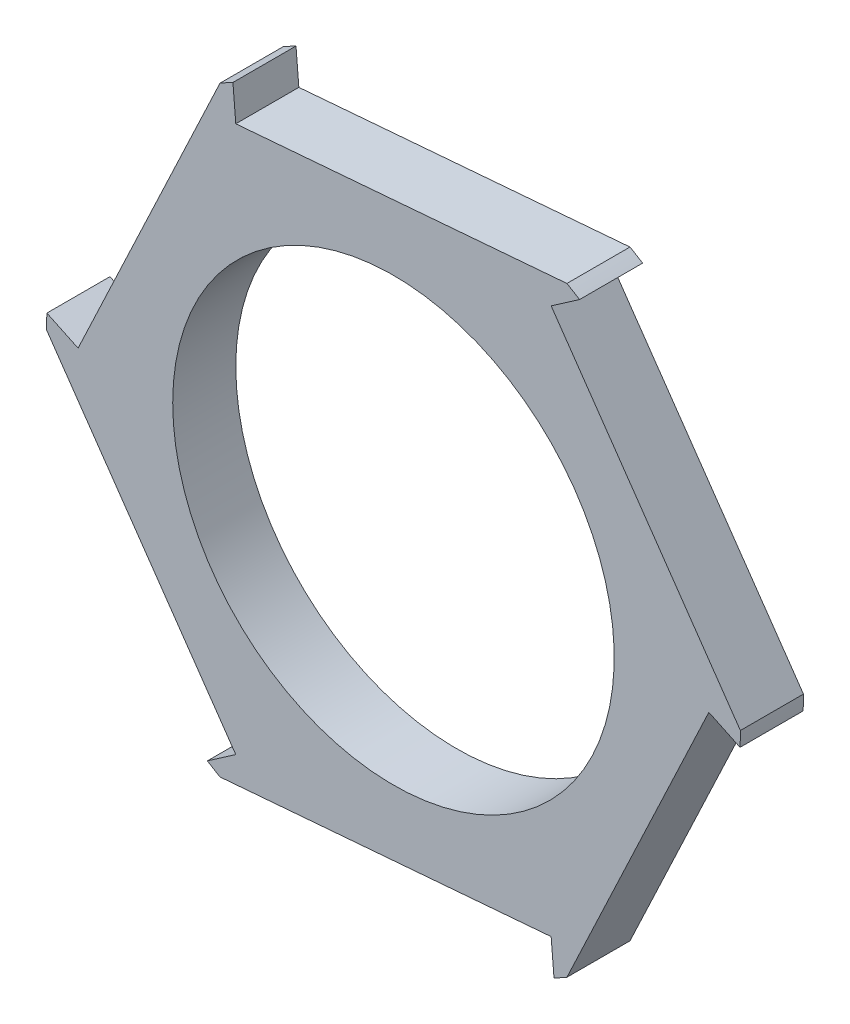
ISO-10303-21;
HEADER;
FILE_DESCRIPTION(('STEP AP214'),'2;1');
FILE_NAME('part.step','',(''),(''),'','','');
FILE_SCHEMA(('AUTOMOTIVE_DESIGN { 1 0 10303 214 1 1 1 1 }'));
ENDSEC;
DATA;
#1=APPLICATION_CONTEXT('core data for automotive mechanical design processes');
#2=APPLICATION_PROTOCOL_DEFINITION('international standard','automotive_design',2000,#1);
#3=PRODUCT_CONTEXT('',#1,'mechanical');
#4=PRODUCT('Part','Part','',(#3));
#5=PRODUCT_RELATED_PRODUCT_CATEGORY('part','',(#4));
#6=PRODUCT_DEFINITION_FORMATION('','',#4);
#7=PRODUCT_DEFINITION_CONTEXT('part definition',#1,'design');
#8=PRODUCT_DEFINITION('design','',#6,#7);
#9=PRODUCT_DEFINITION_SHAPE('','',#8);
#10=(LENGTH_UNIT() NAMED_UNIT(*) SI_UNIT(.MILLI.,.METRE.));
#11=(NAMED_UNIT(*) PLANE_ANGLE_UNIT() SI_UNIT($,.RADIAN.));
#12=(NAMED_UNIT(*) SI_UNIT($,.STERADIAN.) SOLID_ANGLE_UNIT());
#13=UNCERTAINTY_MEASURE_WITH_UNIT(LENGTH_MEASURE(1.E-05),#10,'distance_accuracy_value','');
#14=(GEOMETRIC_REPRESENTATION_CONTEXT(3) GLOBAL_UNCERTAINTY_ASSIGNED_CONTEXT((#13)) GLOBAL_UNIT_ASSIGNED_CONTEXT((#10,
#11,#12)) REPRESENTATION_CONTEXT('',''));
#15=CARTESIAN_POINT('',(0.,0.,0.));
#16=DIRECTION('',(0.,0.,1.));
#17=DIRECTION('',(1.,0.,0.));
#18=AXIS2_PLACEMENT_3D('',#15,#16,#17);
#19=CARTESIAN_POINT('',(-74.3243243243249,-51.493402387183,20.));
#20=DIRECTION('',(-0.821994936526787,-0.569494797451498,0.));
#21=DIRECTION('',(0.569494797451498,-0.821994936526787,0.));
#22=AXIS2_PLACEMENT_3D('',#19,#20,#21);
#23=PLANE('',#22);
#24=DIRECTION('',(-0.569494797451498,0.821994936526787,0.));
#25=VECTOR('',#24,1.);
#26=CARTESIAN_POINT('',(-74.3243243243249,-51.493402387183,0.));
#27=LINE('',#26,#25);
#28=CARTESIAN_POINT('',(-49.9999999999992,-86.6025403784443,0.));
#29=VERTEX_POINT('',#28);
#30=CARTESIAN_POINT('',(-110.000000000001,-4.59486077078278E-13,0.));
#31=VERTEX_POINT('',#30);
#32=EDGE_CURVE('E200',#29,#31,#27,.T.);
#33=ORIENTED_EDGE('',*,*,#32,.F.);
#34=DIRECTION('',(0.,0.,-1.));
#35=VECTOR('',#34,1.);
#36=CARTESIAN_POINT('',(-49.9999999999992,-86.6025403784443,20.));
#37=LINE('',#36,#35);
#38=CARTESIAN_POINT('',(-49.9999999999992,-86.6025403784443,20.));
#39=VERTEX_POINT('',#38);
#40=EDGE_CURVE('E11',#39,#29,#37,.T.);
#41=ORIENTED_EDGE('',*,*,#40,.F.);
#42=DIRECTION('',(-0.569494797451498,0.821994936526787,0.));
#43=VECTOR('',#42,1.);
#44=CARTESIAN_POINT('',(-74.3243243243249,-51.493402387183,20.));
#45=LINE('',#44,#43);
#46=CARTESIAN_POINT('',(-110.000000000001,-4.59486077078278E-13,20.));
#47=VERTEX_POINT('',#46);
#48=EDGE_CURVE('E263',#39,#47,#45,.T.);
#49=ORIENTED_EDGE('',*,*,#48,.T.);
#50=DIRECTION('',(0.,0.,-1.));
#51=VECTOR('',#50,1.);
#52=CARTESIAN_POINT('',(-110.000000000001,-4.59486077078278E-13,20.));
#53=LINE('',#52,#51);
#54=EDGE_CURVE('E121',#47,#31,#53,.T.);
#55=ORIENTED_EDGE('',*,*,#54,.T.);
#56=EDGE_LOOP('',(#33,#41,#49,#55));
#57=FACE_BOUND('',#56,.T.);
#58=ADVANCED_FACE('F40',(#57),#23,.T.);
#59=CARTESIAN_POINT('',(24.3243243243242,-35.1091379912608,20.));
#60=DIRECTION('',(0.5694947974515,-0.821994936526786,0.));
#61=DIRECTION('',(0.821994936526786,0.5694947974515,0.));
#62=AXIS2_PLACEMENT_3D('',#59,#60,#61);
#63=PLANE('',#62);
#64=DIRECTION('',(-0.821994936526786,-0.5694947974515,0.));
#65=VECTOR('',#64,1.);
#66=CARTESIAN_POINT('',(24.3243243243242,-35.1091379912608,0.));
#67=LINE('',#66,#65);
#68=CARTESIAN_POINT('',(-59.0004865376652,-92.838260368874,0.));
#69=VERTEX_POINT('',#68);
#70=EDGE_CURVE('E204',#29,#69,#67,.T.);
#71=ORIENTED_EDGE('',*,*,#70,.T.);
#72=DIRECTION('',(0.,0.,-1.));
#73=VECTOR('',#72,1.);
#74=CARTESIAN_POINT('',(-59.0004865376652,-92.838260368874,20.));
#75=LINE('',#74,#73);
#76=CARTESIAN_POINT('',(-59.0004865376652,-92.838260368874,20.));
#77=VERTEX_POINT('',#76);
#78=EDGE_CURVE('E49',#77,#69,#75,.T.);
#79=ORIENTED_EDGE('',*,*,#78,.F.);
#80=DIRECTION('',(-0.821994936526786,-0.5694947974515,0.));
#81=VECTOR('',#80,1.);
#82=CARTESIAN_POINT('',(24.3243243243242,-35.1091379912608,20.));
#83=LINE('',#82,#81);
#84=EDGE_CURVE('E338',#39,#77,#83,.T.);
#85=ORIENTED_EDGE('',*,*,#84,.F.);
#86=ORIENTED_EDGE('',*,*,#40,.T.);
#87=EDGE_LOOP('',(#71,#79,#85,#86));
#88=FACE_BOUND('',#87,.T.);
#89=ADVANCED_FACE('F408',(#88),#63,.F.);
#90=CARTESIAN_POINT('',(0.,0.,20.));
#91=DIRECTION('',(0.,0.,-1.));
#92=DIRECTION('',(-1.,0.,0.));
#93=AXIS2_PLACEMENT_3D('',#90,#91,#92);
#94=CYLINDRICAL_SURFACE('',#93,110.);
#95=CARTESIAN_POINT('',(0.,0.,0.));
#96=DIRECTION('',(0.,0.,1.));
#97=DIRECTION('',(1.,0.,0.));
#98=AXIS2_PLACEMENT_3D('',#95,#96,#97);
#99=CIRCLE('',#98,110.);
#100=CARTESIAN_POINT('',(-55.0000000000003,-95.2627944162884,0.));
#101=VERTEX_POINT('',#100);
#102=EDGE_CURVE('E208',#69,#101,#99,.T.);
#103=ORIENTED_EDGE('',*,*,#102,.T.);
#104=DIRECTION('',(0.,0.,-1.));
#105=VECTOR('',#104,1.);
#106=CARTESIAN_POINT('',(-55.0000000000003,-95.2627944162884,20.));
#107=LINE('',#106,#105);
#108=CARTESIAN_POINT('',(-55.0000000000003,-95.2627944162884,20.));
#109=VERTEX_POINT('',#108);
#110=EDGE_CURVE('E307',#109,#101,#107,.T.);
#111=ORIENTED_EDGE('',*,*,#110,.F.);
#112=CARTESIAN_POINT('',(0.,0.,20.));
#113=DIRECTION('',(0.,0.,1.));
#114=DIRECTION('',(1.,0.,0.));
#115=AXIS2_PLACEMENT_3D('',#112,#113,#114);
#116=CIRCLE('',#115,110.);
#117=EDGE_CURVE('E317',#77,#109,#116,.T.);
#118=ORIENTED_EDGE('',*,*,#117,.F.);
#119=ORIENTED_EDGE('',*,*,#78,.T.);
#120=EDGE_LOOP('',(#103,#111,#118,#119));
#121=FACE_BOUND('',#120,.T.);
#122=ADVANCED_FACE('F315',(#121),#94,.T.);
#123=CARTESIAN_POINT('',(7.43243243243228,-90.1134541775702,20.));
#124=DIRECTION('',(0.0821994936526767,-0.996615895540124,0.));
#125=DIRECTION('',(0.996615895540124,0.0821994936526767,0.));
#126=AXIS2_PLACEMENT_3D('',#123,#124,#125);
#127=PLANE('',#126);
#128=DIRECTION('',(-0.996615895540124,-0.0821994936526767,0.));
#129=VECTOR('',#128,1.);
#130=CARTESIAN_POINT('',(7.43243243243228,-90.1134541775702,0.));
#131=LINE('',#130,#129);
#132=CARTESIAN_POINT('',(50.0000000000004,-86.6025403784443,0.));
#133=VERTEX_POINT('',#132);
#134=EDGE_CURVE('E212',#133,#101,#131,.T.);
#135=ORIENTED_EDGE('',*,*,#134,.F.);
#136=DIRECTION('',(0.,0.,-1.));
#137=VECTOR('',#136,1.);
#138=CARTESIAN_POINT('',(50.0000000000004,-86.6025403784443,20.));
#139=LINE('',#138,#137);
#140=CARTESIAN_POINT('',(50.0000000000004,-86.6025403784443,20.));
#141=VERTEX_POINT('',#140);
#142=EDGE_CURVE('E304',#141,#133,#139,.T.);
#143=ORIENTED_EDGE('',*,*,#142,.F.);
#144=DIRECTION('',(-0.996615895540124,-0.0821994936526767,0.));
#145=VECTOR('',#144,1.);
#146=CARTESIAN_POINT('',(7.43243243243228,-90.1134541775702,20.));
#147=LINE('',#146,#145);
#148=EDGE_CURVE('E330',#141,#109,#147,.T.);
#149=ORIENTED_EDGE('',*,*,#148,.T.);
#150=ORIENTED_EDGE('',*,*,#110,.T.);
#151=EDGE_LOOP('',(#135,#143,#149,#150));
#152=FACE_BOUND('',#151,.T.);
#153=ADVANCED_FACE('F326',(#152),#127,.T.);
#154=CARTESIAN_POINT('',(42.567567567567,3.51091379912613,20.));
#155=DIRECTION('',(0.996615895540124,0.0821994936526803,0.));
#156=DIRECTION('',(-0.0821994936526803,0.996615895540124,0.));
#157=AXIS2_PLACEMENT_3D('',#154,#155,#156);
#158=PLANE('',#157);
#159=DIRECTION('',(0.0821994936526803,-0.996615895540124,0.));
#160=VECTOR('',#159,1.);
#161=CARTESIAN_POINT('',(42.567567567567,3.51091379912613,0.));
#162=LINE('',#161,#160);
#163=CARTESIAN_POINT('',(50.9000486537661,-97.5150503616966,0.));
#164=VERTEX_POINT('',#163);
#165=EDGE_CURVE('E216',#133,#164,#162,.T.);
#166=ORIENTED_EDGE('',*,*,#165,.T.);
#167=DIRECTION('',(0.,0.,-1.));
#168=VECTOR('',#167,1.);
#169=CARTESIAN_POINT('',(50.9000486537661,-97.5150503616966,20.));
#170=LINE('',#169,#168);
#171=CARTESIAN_POINT('',(50.9000486537661,-97.5150503616966,20.));
#172=VERTEX_POINT('',#171);
#173=EDGE_CURVE('E300',#172,#164,#170,.T.);
#174=ORIENTED_EDGE('',*,*,#173,.F.);
#175=DIRECTION('',(0.0821994936526803,-0.996615895540124,0.));
#176=VECTOR('',#175,1.);
#177=CARTESIAN_POINT('',(42.567567567567,3.51091379912613,20.));
#178=LINE('',#177,#176);
#179=EDGE_CURVE('E332',#141,#172,#178,.T.);
#180=ORIENTED_EDGE('',*,*,#179,.F.);
#181=ORIENTED_EDGE('',*,*,#142,.T.);
#182=EDGE_LOOP('',(#166,#174,#180,#181));
#183=FACE_BOUND('',#182,.T.);
#184=ADVANCED_FACE('F419',(#183),#158,.F.);
#185=CARTESIAN_POINT('',(0.,0.,20.));
#186=DIRECTION('',(0.,0.,-1.));
#187=DIRECTION('',(-1.,0.,0.));
#188=AXIS2_PLACEMENT_3D('',#185,#186,#187);
#189=CYLINDRICAL_SURFACE('',#188,110.);
#190=CARTESIAN_POINT('',(0.,0.,0.));
#191=DIRECTION('',(0.,0.,1.));
#192=DIRECTION('',(1.,0.,0.));
#193=AXIS2_PLACEMENT_3D('',#190,#191,#192);
#194=CIRCLE('',#193,110.);
#195=CARTESIAN_POINT('',(55.0000000000002,-95.2627944162886,0.));
#196=VERTEX_POINT('',#195);
#197=EDGE_CURVE('E219',#164,#196,#194,.T.);
#198=ORIENTED_EDGE('',*,*,#197,.T.);
#199=DIRECTION('',(0.,0.,-1.));
#200=VECTOR('',#199,1.);
#201=CARTESIAN_POINT('',(55.0000000000002,-95.2627944162886,20.));
#202=LINE('',#201,#200);
#203=CARTESIAN_POINT('',(55.0000000000002,-95.2627944162886,20.));
#204=VERTEX_POINT('',#203);
#205=EDGE_CURVE('E297',#204,#196,#202,.T.);
#206=ORIENTED_EDGE('',*,*,#205,.F.);
#207=CARTESIAN_POINT('',(0.,0.,20.));
#208=DIRECTION('',(0.,0.,1.));
#209=DIRECTION('',(1.,0.,0.));
#210=AXIS2_PLACEMENT_3D('',#207,#208,#209);
#211=CIRCLE('',#210,110.);
#212=EDGE_CURVE('E336',#172,#204,#211,.T.);
#213=ORIENTED_EDGE('',*,*,#212,.F.);
#214=ORIENTED_EDGE('',*,*,#173,.T.);
#215=EDGE_LOOP('',(#198,#206,#213,#214));
#216=FACE_BOUND('',#215,.T.);
#217=ADVANCED_FACE('F422',(#216),#189,.T.);
#218=CARTESIAN_POINT('',(81.7567567567566,-38.6200517903872,20.));
#219=DIRECTION('',(0.904194430179464,-0.427121098088626,0.));
#220=DIRECTION('',(0.427121098088626,0.904194430179464,0.));
#221=AXIS2_PLACEMENT_3D('',#218,#219,#220);
#222=PLANE('',#221);
#223=DIRECTION('',(-0.427121098088626,-0.904194430179464,0.));
#224=VECTOR('',#223,1.);
#225=CARTESIAN_POINT('',(81.7567567567566,-38.6200517903872,0.));
#226=LINE('',#225,#224);
#227=CARTESIAN_POINT('',(100.,0.,0.));
#228=VERTEX_POINT('',#227);
#229=EDGE_CURVE('E223',#228,#196,#226,.T.);
#230=ORIENTED_EDGE('',*,*,#229,.F.);
#231=DIRECTION('',(0.,0.,-1.));
#232=VECTOR('',#231,1.);
#233=CARTESIAN_POINT('',(100.,0.,20.));
#234=LINE('',#233,#232);
#235=CARTESIAN_POINT('',(100.,0.,20.));
#236=VERTEX_POINT('',#235);
#237=EDGE_CURVE('E294',#236,#228,#234,.T.);
#238=ORIENTED_EDGE('',*,*,#237,.F.);
#239=DIRECTION('',(-0.427121098088626,-0.904194430179464,0.));
#240=VECTOR('',#239,1.);
#241=CARTESIAN_POINT('',(81.7567567567566,-38.6200517903872,20.));
#242=LINE('',#241,#240);
#243=EDGE_CURVE('E344',#236,#204,#242,.T.);
#244=ORIENTED_EDGE('',*,*,#243,.T.);
#245=ORIENTED_EDGE('',*,*,#205,.T.);
#246=EDGE_LOOP('',(#230,#238,#244,#245));
#247=FACE_BOUND('',#246,.T.);
#248=ADVANCED_FACE('F426',(#247),#222,.T.);
#249=CARTESIAN_POINT('',(18.2432432432431,38.6200517903869,20.));
#250=DIRECTION('',(0.427121098088623,0.904194430179466,0.));
#251=DIRECTION('',(-0.904194430179466,0.427121098088623,0.));
#252=AXIS2_PLACEMENT_3D('',#249,#250,#251);
#253=PLANE('',#252);
#254=DIRECTION('',(0.904194430179466,-0.427121098088623,0.));
#255=VECTOR('',#254,1.);
#256=CARTESIAN_POINT('',(18.2432432432431,38.6200517903869,0.));
#257=LINE('',#256,#255);
#258=CARTESIAN_POINT('',(109.900535191431,-4.6767899928226,0.));
#259=VERTEX_POINT('',#258);
#260=EDGE_CURVE('E227',#228,#259,#257,.T.);
#261=ORIENTED_EDGE('',*,*,#260,.T.);
#262=DIRECTION('',(0.,0.,-1.));
#263=VECTOR('',#262,1.);
#264=CARTESIAN_POINT('',(109.900535191431,-4.6767899928226,20.));
#265=LINE('',#264,#263);
#266=CARTESIAN_POINT('',(109.900535191431,-4.6767899928226,20.));
#267=VERTEX_POINT('',#266);
#268=EDGE_CURVE('E290',#267,#259,#265,.T.);
#269=ORIENTED_EDGE('',*,*,#268,.F.);
#270=DIRECTION('',(0.904194430179466,-0.427121098088623,0.));
#271=VECTOR('',#270,1.);
#272=CARTESIAN_POINT('',(18.2432432432431,38.6200517903869,20.));
#273=LINE('',#272,#271);
#274=EDGE_CURVE('E348',#236,#267,#273,.T.);
#275=ORIENTED_EDGE('',*,*,#274,.F.);
#276=ORIENTED_EDGE('',*,*,#237,.T.);
#277=EDGE_LOOP('',(#261,#269,#275,#276));
#278=FACE_BOUND('',#277,.T.);
#279=ADVANCED_FACE('F430',(#278),#253,.F.);
#280=CARTESIAN_POINT('',(0.,0.,20.));
#281=DIRECTION('',(0.,0.,-1.));
#282=DIRECTION('',(-1.,0.,0.));
#283=AXIS2_PLACEMENT_3D('',#280,#281,#282);
#284=CYLINDRICAL_SURFACE('',#283,110.);
#285=CARTESIAN_POINT('',(0.,0.,0.));
#286=DIRECTION('',(0.,0.,1.));
#287=DIRECTION('',(1.,0.,0.));
#288=AXIS2_PLACEMENT_3D('',#285,#286,#287);
#289=CIRCLE('',#288,110.);
#290=CARTESIAN_POINT('',(110.,-1.29528332503935E-12,0.));
#291=VERTEX_POINT('',#290);
#292=EDGE_CURVE('E230',#259,#291,#289,.T.);
#293=ORIENTED_EDGE('',*,*,#292,.T.);
#294=DIRECTION('',(0.,0.,-1.));
#295=VECTOR('',#294,1.);
#296=CARTESIAN_POINT('',(110.,-1.29528332503935E-12,20.));
#297=LINE('',#296,#295);
#298=CARTESIAN_POINT('',(110.,-1.29528332503935E-12,20.));
#299=VERTEX_POINT('',#298);
#300=EDGE_CURVE('E287',#299,#291,#297,.T.);
#301=ORIENTED_EDGE('',*,*,#300,.F.);
#302=CARTESIAN_POINT('',(0.,0.,20.));
#303=DIRECTION('',(0.,0.,1.));
#304=DIRECTION('',(1.,0.,0.));
#305=AXIS2_PLACEMENT_3D('',#302,#303,#304);
#306=CIRCLE('',#305,110.);
#307=EDGE_CURVE('E351',#267,#299,#306,.T.);
#308=ORIENTED_EDGE('',*,*,#307,.F.);
#309=ORIENTED_EDGE('',*,*,#268,.T.);
#310=EDGE_LOOP('',(#293,#301,#308,#309));
#311=FACE_BOUND('',#310,.T.);
#312=ADVANCED_FACE('F434',(#311),#284,.T.);
#313=CARTESIAN_POINT('',(74.3243243243244,51.4934023871826,20.));
#314=DIRECTION('',(0.821994936526788,0.569494797451498,0.));
#315=DIRECTION('',(-0.569494797451498,0.821994936526788,0.));
#316=AXIS2_PLACEMENT_3D('',#313,#314,#315);
#317=PLANE('',#316);
#318=DIRECTION('',(0.569494797451498,-0.821994936526788,0.));
#319=VECTOR('',#318,1.);
#320=CARTESIAN_POINT('',(74.3243243243244,51.4934023871826,0.));
#321=LINE('',#320,#319);
#322=CARTESIAN_POINT('',(49.9999999999998,86.602540378444,0.));
#323=VERTEX_POINT('',#322);
#324=EDGE_CURVE('E234',#323,#291,#321,.T.);
#325=ORIENTED_EDGE('',*,*,#324,.F.);
#326=DIRECTION('',(0.,0.,-1.));
#327=VECTOR('',#326,1.);
#328=CARTESIAN_POINT('',(49.9999999999998,86.602540378444,20.));
#329=LINE('',#328,#327);
#330=CARTESIAN_POINT('',(49.9999999999998,86.602540378444,20.));
#331=VERTEX_POINT('',#330);
#332=EDGE_CURVE('E284',#331,#323,#329,.T.);
#333=ORIENTED_EDGE('',*,*,#332,.F.);
#334=DIRECTION('',(0.569494797451498,-0.821994936526788,0.));
#335=VECTOR('',#334,1.);
#336=CARTESIAN_POINT('',(74.3243243243244,51.4934023871826,20.));
#337=LINE('',#336,#335);
#338=EDGE_CURVE('E354',#331,#299,#337,.T.);
#339=ORIENTED_EDGE('',*,*,#338,.T.);
#340=ORIENTED_EDGE('',*,*,#300,.T.);
#341=EDGE_LOOP('',(#325,#333,#339,#340));
#342=FACE_BOUND('',#341,.T.);
#343=ADVANCED_FACE('F438',(#342),#317,.T.);
#344=CARTESIAN_POINT('',(-24.3243243243244,35.1091379912612,20.));
#345=DIRECTION('',(-0.569494797451499,0.821994936526787,0.));
#346=DIRECTION('',(-0.821994936526787,-0.569494797451499,0.));
#347=AXIS2_PLACEMENT_3D('',#344,#345,#346);
#348=PLANE('',#347);
#349=DIRECTION('',(0.821994936526787,0.569494797451499,0.));
#350=VECTOR('',#349,1.);
#351=CARTESIAN_POINT('',(-24.3243243243244,35.1091379912612,0.));
#352=LINE('',#351,#350);
#353=CARTESIAN_POINT('',(59.0004865376645,92.8382603688738,0.));
#354=VERTEX_POINT('',#353);
#355=EDGE_CURVE('E238',#323,#354,#352,.T.);
#356=ORIENTED_EDGE('',*,*,#355,.T.);
#357=DIRECTION('',(0.,0.,-1.));
#358=VECTOR('',#357,1.);
#359=CARTESIAN_POINT('',(59.0004865376645,92.8382603688738,20.));
#360=LINE('',#359,#358);
#361=CARTESIAN_POINT('',(59.0004865376645,92.8382603688738,20.));
#362=VERTEX_POINT('',#361);
#363=EDGE_CURVE('E280',#362,#354,#360,.T.);
#364=ORIENTED_EDGE('',*,*,#363,.F.);
#365=DIRECTION('',(0.821994936526787,0.569494797451499,0.));
#366=VECTOR('',#365,1.);
#367=CARTESIAN_POINT('',(-24.3243243243244,35.1091379912612,20.));
#368=LINE('',#367,#366);
#369=EDGE_CURVE('E358',#331,#362,#368,.T.);
#370=ORIENTED_EDGE('',*,*,#369,.F.);
#371=ORIENTED_EDGE('',*,*,#332,.T.);
#372=EDGE_LOOP('',(#356,#364,#370,#371));
#373=FACE_BOUND('',#372,.T.);
#374=ADVANCED_FACE('F442',(#373),#348,.F.);
#375=CARTESIAN_POINT('',(0.,0.,20.));
#376=DIRECTION('',(0.,0.,-1.));
#377=DIRECTION('',(-1.,0.,0.));
#378=AXIS2_PLACEMENT_3D('',#375,#376,#377);
#379=CYLINDRICAL_SURFACE('',#378,110.);
#380=CARTESIAN_POINT('',(0.,0.,0.));
#381=DIRECTION('',(0.,0.,1.));
#382=DIRECTION('',(1.,0.,0.));
#383=AXIS2_PLACEMENT_3D('',#380,#381,#382);
#384=CIRCLE('',#383,110.);
#385=CARTESIAN_POINT('',(55.0000000000013,95.2627944162884,0.));
#386=VERTEX_POINT('',#385);
#387=EDGE_CURVE('E241',#354,#386,#384,.T.);
#388=ORIENTED_EDGE('',*,*,#387,.T.);
#389=DIRECTION('',(0.,0.,-1.));
#390=VECTOR('',#389,1.);
#391=CARTESIAN_POINT('',(55.0000000000013,95.2627944162884,20.));
#392=LINE('',#391,#390);
#393=CARTESIAN_POINT('',(55.0000000000013,95.2627944162884,20.));
#394=VERTEX_POINT('',#393);
#395=EDGE_CURVE('E277',#394,#386,#392,.T.);
#396=ORIENTED_EDGE('',*,*,#395,.F.);
#397=CARTESIAN_POINT('',(0.,0.,20.));
#398=DIRECTION('',(0.,0.,1.));
#399=DIRECTION('',(1.,0.,0.));
#400=AXIS2_PLACEMENT_3D('',#397,#398,#399);
#401=CIRCLE('',#400,110.);
#402=EDGE_CURVE('E361',#362,#394,#401,.T.);
#403=ORIENTED_EDGE('',*,*,#402,.F.);
#404=ORIENTED_EDGE('',*,*,#363,.T.);
#405=EDGE_LOOP('',(#388,#396,#403,#404));
#406=FACE_BOUND('',#405,.T.);
#407=ADVANCED_FACE('F446',(#406),#379,.T.);
#408=CARTESIAN_POINT('',(-7.43243243243231,90.1134541775702,20.));
#409=DIRECTION('',(-0.0821994936526771,0.996615895540124,0.));
#410=DIRECTION('',(-0.996615895540124,-0.0821994936526771,0.));
#411=AXIS2_PLACEMENT_3D('',#408,#409,#410);
#412=PLANE('',#411);
#413=DIRECTION('',(0.996615895540124,0.0821994936526771,0.));
#414=VECTOR('',#413,1.);
#415=CARTESIAN_POINT('',(-7.43243243243231,90.1134541775702,0.));
#416=LINE('',#415,#414);
#417=CARTESIAN_POINT('',(-49.9999999999955,86.6025403784436,0.));
#418=VERTEX_POINT('',#417);
#419=EDGE_CURVE('E245',#418,#386,#416,.T.);
#420=ORIENTED_EDGE('',*,*,#419,.F.);
#421=DIRECTION('',(0.,0.,-1.));
#422=VECTOR('',#421,1.);
#423=CARTESIAN_POINT('',(-49.9999999999955,86.6025403784436,20.));
#424=LINE('',#423,#422);
#425=CARTESIAN_POINT('',(-49.9999999999955,86.6025403784436,20.));
#426=VERTEX_POINT('',#425);
#427=EDGE_CURVE('E274',#426,#418,#424,.T.);
#428=ORIENTED_EDGE('',*,*,#427,.F.);
#429=DIRECTION('',(0.996615895540124,0.0821994936526771,0.));
#430=VECTOR('',#429,1.);
#431=CARTESIAN_POINT('',(-7.43243243243231,90.1134541775702,20.));
#432=LINE('',#431,#430);
#433=EDGE_CURVE('E364',#426,#394,#432,.T.);
#434=ORIENTED_EDGE('',*,*,#433,.T.);
#435=ORIENTED_EDGE('',*,*,#395,.T.);
#436=EDGE_LOOP('',(#420,#428,#434,#435));
#437=FACE_BOUND('',#436,.T.);
#438=ADVANCED_FACE('F450',(#437),#412,.T.);
#439=CARTESIAN_POINT('',(-42.5675675675681,-3.51091379912608,20.));
#440=DIRECTION('',(-0.996615895540124,-0.082199493652677,0.));
#441=DIRECTION('',(0.082199493652677,-0.996615895540124,0.));
#442=AXIS2_PLACEMENT_3D('',#439,#440,#441);
#443=PLANE('',#442);
#444=DIRECTION('',(-0.082199493652677,0.996615895540124,0.));
#445=VECTOR('',#444,1.);
#446=CARTESIAN_POINT('',(-42.5675675675681,-3.51091379912608,0.));
#447=LINE('',#446,#445);
#448=CARTESIAN_POINT('',(-50.9000486537668,97.5150503616964,0.));
#449=VERTEX_POINT('',#448);
#450=EDGE_CURVE('E249',#418,#449,#447,.T.);
#451=ORIENTED_EDGE('',*,*,#450,.T.);
#452=DIRECTION('',(0.,0.,-1.));
#453=VECTOR('',#452,1.);
#454=CARTESIAN_POINT('',(-50.9000486537668,97.5150503616964,20.));
#455=LINE('',#454,#453);
#456=CARTESIAN_POINT('',(-50.9000486537668,97.5150503616964,20.));
#457=VERTEX_POINT('',#456);
#458=EDGE_CURVE('E270',#457,#449,#455,.T.);
#459=ORIENTED_EDGE('',*,*,#458,.F.);
#460=DIRECTION('',(-0.082199493652677,0.996615895540124,0.));
#461=VECTOR('',#460,1.);
#462=CARTESIAN_POINT('',(-42.5675675675681,-3.51091379912608,20.));
#463=LINE('',#462,#461);
#464=EDGE_CURVE('E194',#426,#457,#463,.T.);
#465=ORIENTED_EDGE('',*,*,#464,.F.);
#466=ORIENTED_EDGE('',*,*,#427,.T.);
#467=EDGE_LOOP('',(#451,#459,#465,#466));
#468=FACE_BOUND('',#467,.T.);
#469=ADVANCED_FACE('F372',(#468),#443,.F.);
#470=CARTESIAN_POINT('',(0.,0.,20.));
#471=DIRECTION('',(0.,0.,-1.));
#472=DIRECTION('',(-1.,0.,0.));
#473=AXIS2_PLACEMENT_3D('',#470,#471,#472);
#474=CYLINDRICAL_SURFACE('',#473,110.);
#475=CARTESIAN_POINT('',(0.,0.,0.));
#476=DIRECTION('',(0.,0.,1.));
#477=DIRECTION('',(1.,0.,0.));
#478=AXIS2_PLACEMENT_3D('',#475,#476,#477);
#479=CIRCLE('',#478,110.);
#480=CARTESIAN_POINT('',(-54.9999999999953,95.2627944162884,0.));
#481=VERTEX_POINT('',#480);
#482=EDGE_CURVE('E252',#449,#481,#479,.T.);
#483=ORIENTED_EDGE('',*,*,#482,.T.);
#484=DIRECTION('',(0.,0.,-1.));
#485=VECTOR('',#484,1.);
#486=CARTESIAN_POINT('',(-54.9999999999953,95.2627944162884,20.));
#487=LINE('',#486,#485);
#488=CARTESIAN_POINT('',(-54.9999999999953,95.2627944162884,20.));
#489=VERTEX_POINT('',#488);
#490=EDGE_CURVE('E180',#489,#481,#487,.T.);
#491=ORIENTED_EDGE('',*,*,#490,.F.);
#492=CARTESIAN_POINT('',(0.,0.,20.));
#493=DIRECTION('',(0.,0.,1.));
#494=DIRECTION('',(1.,0.,0.));
#495=AXIS2_PLACEMENT_3D('',#492,#493,#494);
#496=CIRCLE('',#495,110.);
#497=EDGE_CURVE('E189',#457,#489,#496,.T.);
#498=ORIENTED_EDGE('',*,*,#497,.F.);
#499=ORIENTED_EDGE('',*,*,#458,.T.);
#500=EDGE_LOOP('',(#483,#491,#498,#499));
#501=FACE_BOUND('',#500,.T.);
#502=ADVANCED_FACE('F376',(#501),#474,.T.);
#503=CARTESIAN_POINT('',(-81.756756756757,38.6200517903877,20.));
#504=DIRECTION('',(-0.904194430179463,0.427121098088628,0.));
#505=DIRECTION('',(-0.427121098088628,-0.904194430179463,0.));
#506=AXIS2_PLACEMENT_3D('',#503,#504,#505);
#507=PLANE('',#506);
#508=DIRECTION('',(0.427121098088628,0.904194430179463,0.));
#509=VECTOR('',#508,1.);
#510=CARTESIAN_POINT('',(-81.756756756757,38.6200517903877,0.));
#511=LINE('',#510,#509);
#512=CARTESIAN_POINT('',(-100.,-7.0082828429463E-13,0.));
#513=VERTEX_POINT('',#512);
#514=EDGE_CURVE('E178',#513,#481,#511,.T.);
#515=ORIENTED_EDGE('',*,*,#514,.F.);
#516=DIRECTION('',(0.,0.,-1.));
#517=VECTOR('',#516,1.);
#518=CARTESIAN_POINT('',(-100.,-7.0082828429463E-13,20.));
#519=LINE('',#518,#517);
#520=CARTESIAN_POINT('',(-100.,-7.0082828429463E-13,20.));
#521=VERTEX_POINT('',#520);
#522=EDGE_CURVE('E172',#521,#513,#519,.T.);
#523=ORIENTED_EDGE('',*,*,#522,.F.);
#524=DIRECTION('',(0.427121098088628,0.904194430179463,0.));
#525=VECTOR('',#524,1.);
#526=CARTESIAN_POINT('',(-81.756756756757,38.6200517903877,20.));
#527=LINE('',#526,#525);
#528=EDGE_CURVE('E176',#521,#489,#527,.T.);
#529=ORIENTED_EDGE('',*,*,#528,.T.);
#530=ORIENTED_EDGE('',*,*,#490,.T.);
#531=EDGE_LOOP('',(#515,#523,#529,#530));
#532=FACE_BOUND('',#531,.T.);
#533=ADVANCED_FACE('F174',(#532),#507,.T.);
#534=CARTESIAN_POINT('',(-18.2432432432432,-38.6200517903873,20.));
#535=DIRECTION('',(-0.427121098088623,-0.904194430179466,0.));
#536=DIRECTION('',(0.904194430179466,-0.427121098088623,0.));
#537=AXIS2_PLACEMENT_3D('',#534,#535,#536);
#538=PLANE('',#537);
#539=DIRECTION('',(-0.904194430179466,0.427121098088623,0.));
#540=VECTOR('',#539,1.);
#541=CARTESIAN_POINT('',(-18.2432432432432,-38.6200517903873,0.));
#542=LINE('',#541,#540);
#543=CARTESIAN_POINT('',(-109.900535191432,4.67678999282241,0.));
#544=VERTEX_POINT('',#543);
#545=EDGE_CURVE('E114',#513,#544,#542,.T.);
#546=ORIENTED_EDGE('',*,*,#545,.T.);
#547=DIRECTION('',(0.,0.,-1.));
#548=VECTOR('',#547,1.);
#549=CARTESIAN_POINT('',(-109.900535191432,4.67678999282241,20.));
#550=LINE('',#549,#548);
#551=CARTESIAN_POINT('',(-109.900535191432,4.67678999282241,20.));
#552=VERTEX_POINT('',#551);
#553=EDGE_CURVE('E181',#552,#544,#550,.T.);
#554=ORIENTED_EDGE('',*,*,#553,.F.);
#555=DIRECTION('',(-0.904194430179466,0.427121098088623,0.));
#556=VECTOR('',#555,1.);
#557=CARTESIAN_POINT('',(-18.2432432432432,-38.6200517903873,20.));
#558=LINE('',#557,#556);
#559=EDGE_CURVE('E183',#521,#552,#558,.T.);
#560=ORIENTED_EDGE('',*,*,#559,.F.);
#561=ORIENTED_EDGE('',*,*,#522,.T.);
#562=EDGE_LOOP('',(#546,#554,#560,#561));
#563=FACE_BOUND('',#562,.T.);
#564=ADVANCED_FACE('F184',(#563),#538,.F.);
#565=CARTESIAN_POINT('',(0.,0.,20.));
#566=DIRECTION('',(0.,0.,-1.));
#567=DIRECTION('',(-1.,0.,0.));
#568=AXIS2_PLACEMENT_3D('',#565,#566,#567);
#569=CYLINDRICAL_SURFACE('',#568,110.);
#570=CARTESIAN_POINT('',(0.,0.,0.));
#571=DIRECTION('',(0.,0.,1.));
#572=DIRECTION('',(1.,0.,0.));
#573=AXIS2_PLACEMENT_3D('',#570,#571,#572);
#574=CIRCLE('',#573,110.);
#575=EDGE_CURVE('E260',#544,#31,#574,.T.);
#576=ORIENTED_EDGE('',*,*,#575,.T.);
#577=ORIENTED_EDGE('',*,*,#54,.F.);
#578=CARTESIAN_POINT('',(0.,0.,20.));
#579=DIRECTION('',(0.,0.,1.));
#580=DIRECTION('',(1.,0.,0.));
#581=AXIS2_PLACEMENT_3D('',#578,#579,#580);
#582=CIRCLE('',#581,110.);
#583=EDGE_CURVE('E57',#552,#47,#582,.T.);
#584=ORIENTED_EDGE('',*,*,#583,.F.);
#585=ORIENTED_EDGE('',*,*,#553,.T.);
#586=EDGE_LOOP('',(#576,#577,#584,#585));
#587=FACE_BOUND('',#586,.T.);
#588=ADVANCED_FACE('F379',(#587),#569,.T.);
#589=CARTESIAN_POINT('',(0.,0.,20.));
#590=DIRECTION('',(0.,0.,1.));
#591=DIRECTION('',(1.,0.,0.));
#592=AXIS2_PLACEMENT_3D('',#589,#590,#591);
#593=PLANE('',#592);
#594=CARTESIAN_POINT('',(0.,0.,20.));
#595=DIRECTION('',(0.,0.,-1.));
#596=DIRECTION('',(-1.,0.,0.));
#597=AXIS2_PLACEMENT_3D('',#594,#595,#596);
#598=CIRCLE('',#597,70.);
#599=CARTESIAN_POINT('',(-70.,0.,20.));
#600=VERTEX_POINT('',#599);
#601=EDGE_CURVE('E205',#600,#600,#598,.T.);
#602=ORIENTED_EDGE('',*,*,#601,.T.);
#603=EDGE_LOOP('',(#602));
#604=FACE_BOUND('',#603,.T.);
#605=ORIENTED_EDGE('',*,*,#48,.F.);
#606=ORIENTED_EDGE('',*,*,#84,.T.);
#607=ORIENTED_EDGE('',*,*,#117,.T.);
#608=ORIENTED_EDGE('',*,*,#148,.F.);
#609=ORIENTED_EDGE('',*,*,#179,.T.);
#610=ORIENTED_EDGE('',*,*,#212,.T.);
#611=ORIENTED_EDGE('',*,*,#243,.F.);
#612=ORIENTED_EDGE('',*,*,#274,.T.);
#613=ORIENTED_EDGE('',*,*,#307,.T.);
#614=ORIENTED_EDGE('',*,*,#338,.F.);
#615=ORIENTED_EDGE('',*,*,#369,.T.);
#616=ORIENTED_EDGE('',*,*,#402,.T.);
#617=ORIENTED_EDGE('',*,*,#433,.F.);
#618=ORIENTED_EDGE('',*,*,#464,.T.);
#619=ORIENTED_EDGE('',*,*,#497,.T.);
#620=ORIENTED_EDGE('',*,*,#528,.F.);
#621=ORIENTED_EDGE('',*,*,#559,.T.);
#622=ORIENTED_EDGE('',*,*,#583,.T.);
#623=EDGE_LOOP('',(#605,#606,#607,#608,#609,#610,#611,#612,#613,#614,#615,#616,#617,#618,#619,
#620,#621,#622));
#624=FACE_BOUND('',#623,.T.);
#625=ADVANCED_FACE('F187',(#604,#624),#593,.T.);
#626=CARTESIAN_POINT('',(0.,0.,0.));
#627=DIRECTION('',(0.,0.,1.));
#628=DIRECTION('',(1.,0.,0.));
#629=AXIS2_PLACEMENT_3D('',#626,#627,#628);
#630=PLANE('',#629);
#631=CARTESIAN_POINT('',(0.,0.,0.));
#632=DIRECTION('',(0.,0.,-1.));
#633=DIRECTION('',(-1.,0.,0.));
#634=AXIS2_PLACEMENT_3D('',#631,#632,#633);
#635=CIRCLE('',#634,70.);
#636=CARTESIAN_POINT('',(-70.,0.,0.));
#637=VERTEX_POINT('',#636);
#638=EDGE_CURVE('E384',#637,#637,#635,.T.);
#639=ORIENTED_EDGE('',*,*,#638,.F.);
#640=EDGE_LOOP('',(#639));
#641=FACE_BOUND('',#640,.T.);
#642=ORIENTED_EDGE('',*,*,#32,.T.);
#643=ORIENTED_EDGE('',*,*,#575,.F.);
#644=ORIENTED_EDGE('',*,*,#545,.F.);
#645=ORIENTED_EDGE('',*,*,#514,.T.);
#646=ORIENTED_EDGE('',*,*,#482,.F.);
#647=ORIENTED_EDGE('',*,*,#450,.F.);
#648=ORIENTED_EDGE('',*,*,#419,.T.);
#649=ORIENTED_EDGE('',*,*,#387,.F.);
#650=ORIENTED_EDGE('',*,*,#355,.F.);
#651=ORIENTED_EDGE('',*,*,#324,.T.);
#652=ORIENTED_EDGE('',*,*,#292,.F.);
#653=ORIENTED_EDGE('',*,*,#260,.F.);
#654=ORIENTED_EDGE('',*,*,#229,.T.);
#655=ORIENTED_EDGE('',*,*,#197,.F.);
#656=ORIENTED_EDGE('',*,*,#165,.F.);
#657=ORIENTED_EDGE('',*,*,#134,.T.);
#658=ORIENTED_EDGE('',*,*,#102,.F.);
#659=ORIENTED_EDGE('',*,*,#70,.F.);
#660=EDGE_LOOP('',(#642,#643,#644,#645,#646,#647,#648,#649,#650,#651,#652,#653,#654,#655,#656,
#657,#658,#659));
#661=FACE_BOUND('',#660,.T.);
#662=ADVANCED_FACE('F321',(#641,#661),#630,.F.);
#663=CARTESIAN_POINT('',(0.,0.,20.));
#664=DIRECTION('',(0.,0.,-1.));
#665=DIRECTION('',(-1.,0.,0.));
#666=AXIS2_PLACEMENT_3D('',#663,#664,#665);
#667=CYLINDRICAL_SURFACE('',#666,70.);
#668=ORIENTED_EDGE('',*,*,#601,.F.);
#669=EDGE_LOOP('',(#668));
#670=FACE_BOUND('',#669,.T.);
#671=ORIENTED_EDGE('',*,*,#638,.T.);
#672=EDGE_LOOP('',(#671));
#673=FACE_BOUND('',#672,.T.);
#674=ADVANCED_FACE('F393',(#670,#673),#667,.F.);
#675=CLOSED_SHELL('',(#58,#89,#122,#153,#184,#217,#248,#279,#312,#343,#374,#407,#438,#469,#502,
#533,#564,#588,#625,#662,#674));
#676=MANIFOLD_SOLID_BREP('B2',#675);
#677=ADVANCED_BREP_SHAPE_REPRESENTATION('',(#18,#676),#14);
#678=SHAPE_DEFINITION_REPRESENTATION(#9,#677);
ENDSEC;
END-ISO-10303-21;
